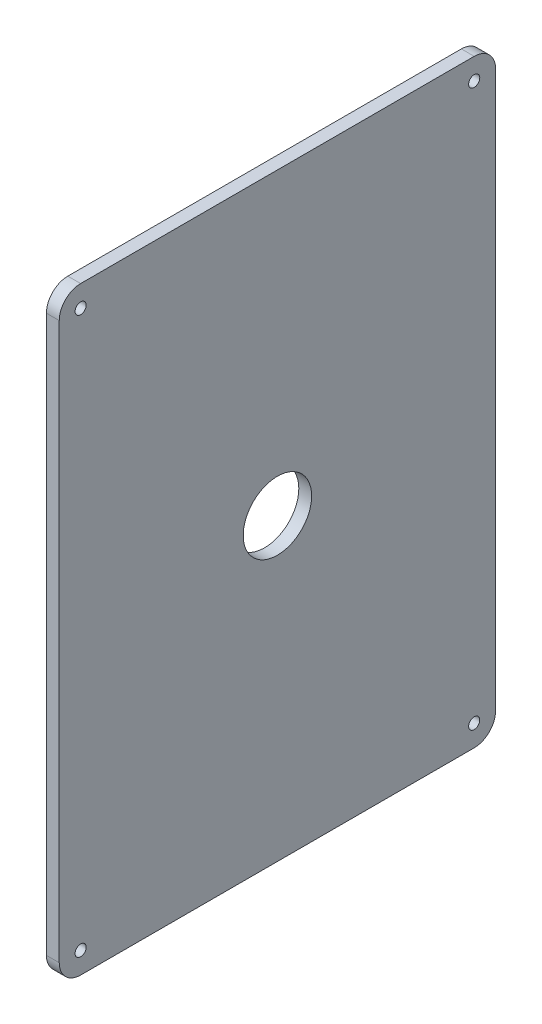
ISO-10303-21;
HEADER;
FILE_DESCRIPTION(('STEP AP214'),'2;1');
FILE_NAME('part.step','',(''),(''),'','','');
FILE_SCHEMA(('AUTOMOTIVE_DESIGN { 1 0 10303 214 1 1 1 1 }'));
ENDSEC;
DATA;
#1=APPLICATION_CONTEXT('core data for automotive mechanical design processes');
#2=APPLICATION_PROTOCOL_DEFINITION('international standard','automotive_design',2000,#1);
#3=PRODUCT_CONTEXT('',#1,'mechanical');
#4=PRODUCT('Part','Part','',(#3));
#5=PRODUCT_RELATED_PRODUCT_CATEGORY('part','',(#4));
#6=PRODUCT_DEFINITION_FORMATION('','',#4);
#7=PRODUCT_DEFINITION_CONTEXT('part definition',#1,'design');
#8=PRODUCT_DEFINITION('design','',#6,#7);
#9=PRODUCT_DEFINITION_SHAPE('','',#8);
#10=(LENGTH_UNIT() NAMED_UNIT(*) SI_UNIT(.MILLI.,.METRE.));
#11=(NAMED_UNIT(*) PLANE_ANGLE_UNIT() SI_UNIT($,.RADIAN.));
#12=(NAMED_UNIT(*) SI_UNIT($,.STERADIAN.) SOLID_ANGLE_UNIT());
#13=UNCERTAINTY_MEASURE_WITH_UNIT(LENGTH_MEASURE(1.E-05),#10,'distance_accuracy_value','');
#14=(GEOMETRIC_REPRESENTATION_CONTEXT(3) GLOBAL_UNCERTAINTY_ASSIGNED_CONTEXT((#13)) GLOBAL_UNIT_ASSIGNED_CONTEXT((#10,
#11,#12)) REPRESENTATION_CONTEXT('',''));
#15=CARTESIAN_POINT('',(0.,0.,0.));
#16=DIRECTION('',(0.,0.,1.));
#17=DIRECTION('',(1.,0.,0.));
#18=AXIS2_PLACEMENT_3D('',#15,#16,#17);
#19=CARTESIAN_POINT('',(3.,0.,0.));
#20=DIRECTION('',(0.,0.,-1.));
#21=DIRECTION('',(0.,1.,0.));
#22=AXIS2_PLACEMENT_3D('',#19,#20,#21);
#23=PLANE('',#22);
#24=DIRECTION('',(0.,-1.,0.));
#25=VECTOR('',#24,1.);
#26=CARTESIAN_POINT('',(3.,0.,0.));
#27=LINE('',#26,#25);
#28=CARTESIAN_POINT('',(3.,-5.,0.));
#29=VERTEX_POINT('',#28);
#30=CARTESIAN_POINT('',(3.,-135.,0.));
#31=VERTEX_POINT('',#30);
#32=EDGE_CURVE('E121',#29,#31,#27,.T.);
#33=ORIENTED_EDGE('',*,*,#32,.F.);
#34=DIRECTION('',(-1.,0.,0.));
#35=VECTOR('',#34,1.);
#36=CARTESIAN_POINT('',(3.,-5.,0.));
#37=LINE('',#36,#35);
#38=CARTESIAN_POINT('',(0.,-5.,0.));
#39=VERTEX_POINT('',#38);
#40=EDGE_CURVE('E106',#29,#39,#37,.T.);
#41=ORIENTED_EDGE('',*,*,#40,.T.);
#42=DIRECTION('',(0.,-1.,0.));
#43=VECTOR('',#42,1.);
#44=CARTESIAN_POINT('',(0.,0.,0.));
#45=LINE('',#44,#43);
#46=CARTESIAN_POINT('',(0.,-135.,0.));
#47=VERTEX_POINT('',#46);
#48=EDGE_CURVE('E118',#39,#47,#45,.T.);
#49=ORIENTED_EDGE('',*,*,#48,.T.);
#50=DIRECTION('',(-1.,0.,0.));
#51=VECTOR('',#50,1.);
#52=CARTESIAN_POINT('',(3.,-135.,0.));
#53=LINE('',#52,#51);
#54=EDGE_CURVE('E123',#47,#31,#53,.F.);
#55=ORIENTED_EDGE('',*,*,#54,.T.);
#56=EDGE_LOOP('',(#33,#41,#49,#55));
#57=FACE_BOUND('',#56,.T.);
#58=ADVANCED_FACE('F34',(#57),#23,.F.);
#59=CARTESIAN_POINT('',(3.,-140.,0.));
#60=DIRECTION('',(0.,1.,0.));
#61=DIRECTION('',(0.,0.,1.));
#62=AXIS2_PLACEMENT_3D('',#59,#60,#61);
#63=PLANE('',#62);
#64=DIRECTION('',(0.,0.,-1.));
#65=VECTOR('',#64,1.);
#66=CARTESIAN_POINT('',(0.,-140.,0.));
#67=LINE('',#66,#65);
#68=CARTESIAN_POINT('',(0.,-140.,-5.00000000000002));
#69=VERTEX_POINT('',#68);
#70=CARTESIAN_POINT('',(0.,-140.,-97.));
#71=VERTEX_POINT('',#70);
#72=EDGE_CURVE('E127',#69,#71,#67,.T.);
#73=ORIENTED_EDGE('',*,*,#72,.T.);
#74=DIRECTION('',(-1.,0.,0.));
#75=VECTOR('',#74,1.);
#76=CARTESIAN_POINT('',(3.,-140.,-97.));
#77=LINE('',#76,#75);
#78=CARTESIAN_POINT('',(3.,-140.,-97.));
#79=VERTEX_POINT('',#78);
#80=EDGE_CURVE('E11',#71,#79,#77,.F.);
#81=ORIENTED_EDGE('',*,*,#80,.T.);
#82=DIRECTION('',(0.,0.,-1.));
#83=VECTOR('',#82,1.);
#84=CARTESIAN_POINT('',(3.,-140.,0.));
#85=LINE('',#84,#83);
#86=CARTESIAN_POINT('',(3.,-140.,-5.00000000000002));
#87=VERTEX_POINT('',#86);
#88=EDGE_CURVE('E184',#87,#79,#85,.T.);
#89=ORIENTED_EDGE('',*,*,#88,.F.);
#90=DIRECTION('',(-1.,0.,0.));
#91=VECTOR('',#90,1.);
#92=CARTESIAN_POINT('',(3.,-140.,-5.00000000000002));
#93=LINE('',#92,#91);
#94=EDGE_CURVE('E43',#87,#69,#93,.T.);
#95=ORIENTED_EDGE('',*,*,#94,.T.);
#96=EDGE_LOOP('',(#73,#81,#89,#95));
#97=FACE_BOUND('',#96,.T.);
#98=ADVANCED_FACE('F202',(#97),#63,.F.);
#99=CARTESIAN_POINT('',(3.,0.,-102.));
#100=DIRECTION('',(0.,0.,1.));
#101=DIRECTION('',(0.,-1.,0.));
#102=AXIS2_PLACEMENT_3D('',#99,#100,#101);
#103=PLANE('',#102);
#104=DIRECTION('',(0.,1.,0.));
#105=VECTOR('',#104,1.);
#106=CARTESIAN_POINT('',(0.,0.,-102.));
#107=LINE('',#106,#105);
#108=CARTESIAN_POINT('',(0.,-135.,-102.));
#109=VERTEX_POINT('',#108);
#110=CARTESIAN_POINT('',(0.,-5.,-102.));
#111=VERTEX_POINT('',#110);
#112=EDGE_CURVE('E131',#109,#111,#107,.T.);
#113=ORIENTED_EDGE('',*,*,#112,.T.);
#114=DIRECTION('',(-1.,0.,0.));
#115=VECTOR('',#114,1.);
#116=CARTESIAN_POINT('',(3.,-5.,-102.));
#117=LINE('',#116,#115);
#118=CARTESIAN_POINT('',(3.,-5.,-102.));
#119=VERTEX_POINT('',#118);
#120=EDGE_CURVE('E51',#111,#119,#117,.F.);
#121=ORIENTED_EDGE('',*,*,#120,.T.);
#122=DIRECTION('',(0.,1.,0.));
#123=VECTOR('',#122,1.);
#124=CARTESIAN_POINT('',(3.,0.,-102.));
#125=LINE('',#124,#123);
#126=CARTESIAN_POINT('',(3.,-135.,-102.));
#127=VERTEX_POINT('',#126);
#128=EDGE_CURVE('E185',#127,#119,#125,.T.);
#129=ORIENTED_EDGE('',*,*,#128,.F.);
#130=DIRECTION('',(-1.,0.,0.));
#131=VECTOR('',#130,1.);
#132=CARTESIAN_POINT('',(3.,-135.,-102.));
#133=LINE('',#132,#131);
#134=EDGE_CURVE('E158',#127,#109,#133,.T.);
#135=ORIENTED_EDGE('',*,*,#134,.T.);
#136=EDGE_LOOP('',(#113,#121,#129,#135));
#137=FACE_BOUND('',#136,.T.);
#138=ADVANCED_FACE('F196',(#137),#103,.F.);
#139=CARTESIAN_POINT('',(3.,0.,0.));
#140=DIRECTION('',(0.,-1.,0.));
#141=DIRECTION('',(0.,0.,-1.));
#142=AXIS2_PLACEMENT_3D('',#139,#140,#141);
#143=PLANE('',#142);
#144=DIRECTION('',(0.,0.,1.));
#145=VECTOR('',#144,1.);
#146=CARTESIAN_POINT('',(0.,0.,0.));
#147=LINE('',#146,#145);
#148=CARTESIAN_POINT('',(0.,0.,-97.));
#149=VERTEX_POINT('',#148);
#150=CARTESIAN_POINT('',(0.,0.,-5.));
#151=VERTEX_POINT('',#150);
#152=EDGE_CURVE('E141',#149,#151,#147,.T.);
#153=ORIENTED_EDGE('',*,*,#152,.T.);
#154=DIRECTION('',(-1.,0.,0.));
#155=VECTOR('',#154,1.);
#156=CARTESIAN_POINT('',(3.,0.,-5.));
#157=LINE('',#156,#155);
#158=CARTESIAN_POINT('',(3.,0.,-5.));
#159=VERTEX_POINT('',#158);
#160=EDGE_CURVE('E107',#151,#159,#157,.F.);
#161=ORIENTED_EDGE('',*,*,#160,.T.);
#162=DIRECTION('',(0.,0.,1.));
#163=VECTOR('',#162,1.);
#164=CARTESIAN_POINT('',(3.,0.,0.));
#165=LINE('',#164,#163);
#166=CARTESIAN_POINT('',(3.,0.,-97.));
#167=VERTEX_POINT('',#166);
#168=EDGE_CURVE('E137',#167,#159,#165,.T.);
#169=ORIENTED_EDGE('',*,*,#168,.F.);
#170=DIRECTION('',(-1.,0.,0.));
#171=VECTOR('',#170,1.);
#172=CARTESIAN_POINT('',(3.,0.,-97.));
#173=LINE('',#172,#171);
#174=EDGE_CURVE('E112',#167,#149,#173,.T.);
#175=ORIENTED_EDGE('',*,*,#174,.T.);
#176=EDGE_LOOP('',(#153,#161,#169,#175));
#177=FACE_BOUND('',#176,.T.);
#178=ADVANCED_FACE('F192',(#177),#143,.F.);
#179=CARTESIAN_POINT('',(3.,0.,0.));
#180=DIRECTION('',(1.,0.,0.));
#181=DIRECTION('',(0.,0.,-1.));
#182=AXIS2_PLACEMENT_3D('',#179,#180,#181);
#183=PLANE('',#182);
#184=CARTESIAN_POINT('',(3.,-135.,-97.));
#185=DIRECTION('',(1.,0.,0.));
#186=DIRECTION('',(0.,0.,-1.));
#187=AXIS2_PLACEMENT_3D('',#184,#185,#186);
#188=CIRCLE('',#187,1.29999999999999);
#189=CARTESIAN_POINT('',(3.,-135.,-98.3));
#190=VERTEX_POINT('',#189);
#191=EDGE_CURVE('E339',#190,#190,#188,.T.);
#192=ORIENTED_EDGE('',*,*,#191,.F.);
#193=EDGE_LOOP('',(#192));
#194=FACE_BOUND('',#193,.T.);
#195=CARTESIAN_POINT('',(3.,-5.,-97.));
#196=DIRECTION('',(1.,0.,0.));
#197=DIRECTION('',(0.,0.,-1.));
#198=AXIS2_PLACEMENT_3D('',#195,#196,#197);
#199=CIRCLE('',#198,1.29999999999999);
#200=CARTESIAN_POINT('',(3.,-5.,-98.3));
#201=VERTEX_POINT('',#200);
#202=EDGE_CURVE('E340',#201,#201,#199,.T.);
#203=ORIENTED_EDGE('',*,*,#202,.F.);
#204=EDGE_LOOP('',(#203));
#205=FACE_BOUND('',#204,.T.);
#206=CARTESIAN_POINT('',(3.,-5.,-5.));
#207=DIRECTION('',(1.,0.,0.));
#208=DIRECTION('',(0.,0.,-1.));
#209=AXIS2_PLACEMENT_3D('',#206,#207,#208);
#210=CIRCLE('',#209,1.3);
#211=CARTESIAN_POINT('',(3.,-5.,-6.3));
#212=VERTEX_POINT('',#211);
#213=EDGE_CURVE('E343',#212,#212,#210,.T.);
#214=ORIENTED_EDGE('',*,*,#213,.F.);
#215=EDGE_LOOP('',(#214));
#216=FACE_BOUND('',#215,.T.);
#217=CARTESIAN_POINT('',(3.,-135.,-5.));
#218=DIRECTION('',(1.,0.,0.));
#219=DIRECTION('',(0.,0.,-1.));
#220=AXIS2_PLACEMENT_3D('',#217,#218,#219);
#221=CIRCLE('',#220,1.29999999999999);
#222=CARTESIAN_POINT('',(3.,-135.,-6.3));
#223=VERTEX_POINT('',#222);
#224=EDGE_CURVE('E168',#223,#223,#221,.T.);
#225=ORIENTED_EDGE('',*,*,#224,.F.);
#226=EDGE_LOOP('',(#225));
#227=FACE_BOUND('',#226,.T.);
#228=CARTESIAN_POINT('',(3.,-70.,-51.));
#229=DIRECTION('',(1.,0.,0.));
#230=DIRECTION('',(0.,0.,-1.));
#231=AXIS2_PLACEMENT_3D('',#228,#229,#230);
#232=CIRCLE('',#231,8.);
#233=CARTESIAN_POINT('',(3.,-70.,-59.));
#234=VERTEX_POINT('',#233);
#235=EDGE_CURVE('E134',#234,#234,#232,.T.);
#236=ORIENTED_EDGE('',*,*,#235,.F.);
#237=EDGE_LOOP('',(#236));
#238=FACE_BOUND('',#237,.T.);
#239=ORIENTED_EDGE('',*,*,#168,.T.);
#240=CARTESIAN_POINT('',(3.,-5.,-5.));
#241=DIRECTION('',(1.,0.,0.));
#242=DIRECTION('',(0.,0.,-1.));
#243=AXIS2_PLACEMENT_3D('',#240,#241,#242);
#244=CIRCLE('',#243,5.);
#245=EDGE_CURVE('E156',#159,#29,#244,.T.);
#246=ORIENTED_EDGE('',*,*,#245,.T.);
#247=ORIENTED_EDGE('',*,*,#32,.T.);
#248=CARTESIAN_POINT('',(3.,-135.,-5.00000000000002));
#249=DIRECTION('',(1.,0.,0.));
#250=DIRECTION('',(0.,0.,-1.));
#251=AXIS2_PLACEMENT_3D('',#248,#249,#250);
#252=CIRCLE('',#251,5.);
#253=EDGE_CURVE('E151',#31,#87,#252,.T.);
#254=ORIENTED_EDGE('',*,*,#253,.T.);
#255=ORIENTED_EDGE('',*,*,#88,.T.);
#256=CARTESIAN_POINT('',(3.,-135.,-97.));
#257=DIRECTION('',(1.,0.,0.));
#258=DIRECTION('',(0.,0.,-1.));
#259=AXIS2_PLACEMENT_3D('',#256,#257,#258);
#260=CIRCLE('',#259,5.);
#261=EDGE_CURVE('E58',#79,#127,#260,.T.);
#262=ORIENTED_EDGE('',*,*,#261,.T.);
#263=ORIENTED_EDGE('',*,*,#128,.T.);
#264=CARTESIAN_POINT('',(3.,-5.,-97.));
#265=DIRECTION('',(1.,0.,0.));
#266=DIRECTION('',(0.,0.,-1.));
#267=AXIS2_PLACEMENT_3D('',#264,#265,#266);
#268=CIRCLE('',#267,5.);
#269=EDGE_CURVE('E154',#119,#167,#268,.T.);
#270=ORIENTED_EDGE('',*,*,#269,.T.);
#271=EDGE_LOOP('',(#239,#246,#247,#254,#255,#262,#263,#270));
#272=FACE_BOUND('',#271,.T.);
#273=ADVANCED_FACE('F189',(#194,#205,#216,#227,#238,#272),#183,.T.);
#274=CARTESIAN_POINT('',(0.,0.,0.));
#275=DIRECTION('',(1.,0.,0.));
#276=DIRECTION('',(0.,0.,-1.));
#277=AXIS2_PLACEMENT_3D('',#274,#275,#276);
#278=PLANE('',#277);
#279=CARTESIAN_POINT('',(0.,-135.,-97.));
#280=DIRECTION('',(1.,0.,0.));
#281=DIRECTION('',(0.,0.,-1.));
#282=AXIS2_PLACEMENT_3D('',#279,#280,#281);
#283=CIRCLE('',#282,1.29999999999999);
#284=CARTESIAN_POINT('',(0.,-135.,-98.3));
#285=VERTEX_POINT('',#284);
#286=EDGE_CURVE('E38',#285,#285,#283,.T.);
#287=ORIENTED_EDGE('',*,*,#286,.T.);
#288=EDGE_LOOP('',(#287));
#289=FACE_BOUND('',#288,.T.);
#290=CARTESIAN_POINT('',(0.,-5.,-97.));
#291=DIRECTION('',(1.,0.,0.));
#292=DIRECTION('',(0.,0.,-1.));
#293=AXIS2_PLACEMENT_3D('',#290,#291,#292);
#294=CIRCLE('',#293,1.29999999999999);
#295=CARTESIAN_POINT('',(0.,-5.,-98.3));
#296=VERTEX_POINT('',#295);
#297=EDGE_CURVE('E170',#296,#296,#294,.T.);
#298=ORIENTED_EDGE('',*,*,#297,.T.);
#299=EDGE_LOOP('',(#298));
#300=FACE_BOUND('',#299,.T.);
#301=CARTESIAN_POINT('',(0.,-5.,-5.));
#302=DIRECTION('',(1.,0.,0.));
#303=DIRECTION('',(0.,0.,-1.));
#304=AXIS2_PLACEMENT_3D('',#301,#302,#303);
#305=CIRCLE('',#304,1.3);
#306=CARTESIAN_POINT('',(0.,-5.,-6.3));
#307=VERTEX_POINT('',#306);
#308=EDGE_CURVE('E167',#307,#307,#305,.T.);
#309=ORIENTED_EDGE('',*,*,#308,.T.);
#310=EDGE_LOOP('',(#309));
#311=FACE_BOUND('',#310,.T.);
#312=CARTESIAN_POINT('',(0.,-135.,-5.));
#313=DIRECTION('',(1.,0.,0.));
#314=DIRECTION('',(0.,0.,-1.));
#315=AXIS2_PLACEMENT_3D('',#312,#313,#314);
#316=CIRCLE('',#315,1.29999999999999);
#317=CARTESIAN_POINT('',(0.,-135.,-6.3));
#318=VERTEX_POINT('',#317);
#319=EDGE_CURVE('E164',#318,#318,#316,.T.);
#320=ORIENTED_EDGE('',*,*,#319,.T.);
#321=EDGE_LOOP('',(#320));
#322=FACE_BOUND('',#321,.T.);
#323=CARTESIAN_POINT('',(0.,-70.,-51.));
#324=DIRECTION('',(1.,0.,0.));
#325=DIRECTION('',(0.,0.,-1.));
#326=AXIS2_PLACEMENT_3D('',#323,#324,#325);
#327=CIRCLE('',#326,8.);
#328=CARTESIAN_POINT('',(0.,-70.,-59.));
#329=VERTEX_POINT('',#328);
#330=EDGE_CURVE('E128',#329,#329,#327,.T.);
#331=ORIENTED_EDGE('',*,*,#330,.T.);
#332=EDGE_LOOP('',(#331));
#333=FACE_BOUND('',#332,.T.);
#334=ORIENTED_EDGE('',*,*,#48,.F.);
#335=CARTESIAN_POINT('',(0.,-5.,-5.));
#336=DIRECTION('',(1.,0.,0.));
#337=DIRECTION('',(0.,0.,-1.));
#338=AXIS2_PLACEMENT_3D('',#335,#336,#337);
#339=CIRCLE('',#338,5.);
#340=EDGE_CURVE('E102',#39,#151,#339,.F.);
#341=ORIENTED_EDGE('',*,*,#340,.T.);
#342=ORIENTED_EDGE('',*,*,#152,.F.);
#343=CARTESIAN_POINT('',(0.,-5.,-97.));
#344=DIRECTION('',(1.,0.,0.));
#345=DIRECTION('',(0.,0.,-1.));
#346=AXIS2_PLACEMENT_3D('',#343,#344,#345);
#347=CIRCLE('',#346,5.);
#348=EDGE_CURVE('E113',#149,#111,#347,.F.);
#349=ORIENTED_EDGE('',*,*,#348,.T.);
#350=ORIENTED_EDGE('',*,*,#112,.F.);
#351=CARTESIAN_POINT('',(0.,-135.,-97.));
#352=DIRECTION('',(1.,0.,0.));
#353=DIRECTION('',(0.,0.,-1.));
#354=AXIS2_PLACEMENT_3D('',#351,#352,#353);
#355=CIRCLE('',#354,5.);
#356=EDGE_CURVE('E145',#109,#71,#355,.F.);
#357=ORIENTED_EDGE('',*,*,#356,.T.);
#358=ORIENTED_EDGE('',*,*,#72,.F.);
#359=CARTESIAN_POINT('',(0.,-135.,-5.00000000000002));
#360=DIRECTION('',(1.,0.,0.));
#361=DIRECTION('',(0.,0.,-1.));
#362=AXIS2_PLACEMENT_3D('',#359,#360,#361);
#363=CIRCLE('',#362,5.);
#364=EDGE_CURVE('E122',#69,#47,#363,.F.);
#365=ORIENTED_EDGE('',*,*,#364,.T.);
#366=EDGE_LOOP('',(#334,#341,#342,#349,#350,#357,#358,#365));
#367=FACE_BOUND('',#366,.T.);
#368=ADVANCED_FACE('F125',(#289,#300,#311,#322,#333,#367),#278,.F.);
#369=CARTESIAN_POINT('',(3.,-5.,-5.));
#370=DIRECTION('',(-1.,0.,0.));
#371=DIRECTION('',(0.,0.,1.));
#372=AXIS2_PLACEMENT_3D('',#369,#370,#371);
#373=CYLINDRICAL_SURFACE('',#372,5.);
#374=ORIENTED_EDGE('',*,*,#245,.F.);
#375=ORIENTED_EDGE('',*,*,#160,.F.);
#376=ORIENTED_EDGE('',*,*,#340,.F.);
#377=ORIENTED_EDGE('',*,*,#40,.F.);
#378=EDGE_LOOP('',(#374,#375,#376,#377));
#379=FACE_BOUND('',#378,.T.);
#380=ADVANCED_FACE('F105',(#379),#373,.T.);
#381=CARTESIAN_POINT('',(3.,-5.,-97.));
#382=DIRECTION('',(-1.,0.,0.));
#383=DIRECTION('',(0.,0.,1.));
#384=AXIS2_PLACEMENT_3D('',#381,#382,#383);
#385=CYLINDRICAL_SURFACE('',#384,5.);
#386=ORIENTED_EDGE('',*,*,#269,.F.);
#387=ORIENTED_EDGE('',*,*,#120,.F.);
#388=ORIENTED_EDGE('',*,*,#348,.F.);
#389=ORIENTED_EDGE('',*,*,#174,.F.);
#390=EDGE_LOOP('',(#386,#387,#388,#389));
#391=FACE_BOUND('',#390,.T.);
#392=ADVANCED_FACE('F194',(#391),#385,.T.);
#393=CARTESIAN_POINT('',(3.,-135.,-97.));
#394=DIRECTION('',(-1.,0.,0.));
#395=DIRECTION('',(0.,0.,1.));
#396=AXIS2_PLACEMENT_3D('',#393,#394,#395);
#397=CYLINDRICAL_SURFACE('',#396,5.);
#398=ORIENTED_EDGE('',*,*,#261,.F.);
#399=ORIENTED_EDGE('',*,*,#80,.F.);
#400=ORIENTED_EDGE('',*,*,#356,.F.);
#401=ORIENTED_EDGE('',*,*,#134,.F.);
#402=EDGE_LOOP('',(#398,#399,#400,#401));
#403=FACE_BOUND('',#402,.T.);
#404=ADVANCED_FACE('F199',(#403),#397,.T.);
#405=CARTESIAN_POINT('',(3.,-135.,-5.00000000000002));
#406=DIRECTION('',(-1.,0.,0.));
#407=DIRECTION('',(0.,0.,1.));
#408=AXIS2_PLACEMENT_3D('',#405,#406,#407);
#409=CYLINDRICAL_SURFACE('',#408,5.);
#410=ORIENTED_EDGE('',*,*,#253,.F.);
#411=ORIENTED_EDGE('',*,*,#54,.F.);
#412=ORIENTED_EDGE('',*,*,#364,.F.);
#413=ORIENTED_EDGE('',*,*,#94,.F.);
#414=EDGE_LOOP('',(#410,#411,#412,#413));
#415=FACE_BOUND('',#414,.T.);
#416=ADVANCED_FACE('F36',(#415),#409,.T.);
#417=CARTESIAN_POINT('',(0.,-70.,-51.));
#418=DIRECTION('',(1.,0.,0.));
#419=DIRECTION('',(0.,0.,-1.));
#420=AXIS2_PLACEMENT_3D('',#417,#418,#419);
#421=CYLINDRICAL_SURFACE('',#420,8.);
#422=ORIENTED_EDGE('',*,*,#330,.F.);
#423=EDGE_LOOP('',(#422));
#424=FACE_BOUND('',#423,.T.);
#425=ORIENTED_EDGE('',*,*,#235,.T.);
#426=EDGE_LOOP('',(#425));
#427=FACE_BOUND('',#426,.T.);
#428=ADVANCED_FACE('F208',(#424,#427),#421,.F.);
#429=CARTESIAN_POINT('',(-97.,-135.,-5.));
#430=DIRECTION('',(1.,0.,0.));
#431=DIRECTION('',(0.,0.,-1.));
#432=AXIS2_PLACEMENT_3D('',#429,#430,#431);
#433=CYLINDRICAL_SURFACE('',#432,1.29999999999999);
#434=ORIENTED_EDGE('',*,*,#224,.T.);
#435=EDGE_LOOP('',(#434));
#436=FACE_BOUND('',#435,.T.);
#437=ORIENTED_EDGE('',*,*,#319,.F.);
#438=EDGE_LOOP('',(#437));
#439=FACE_BOUND('',#438,.T.);
#440=ADVANCED_FACE('F213',(#436,#439),#433,.F.);
#441=CARTESIAN_POINT('',(-97.,-5.,-5.));
#442=DIRECTION('',(1.,0.,0.));
#443=DIRECTION('',(0.,0.,-1.));
#444=AXIS2_PLACEMENT_3D('',#441,#442,#443);
#445=CYLINDRICAL_SURFACE('',#444,1.3);
#446=ORIENTED_EDGE('',*,*,#213,.T.);
#447=EDGE_LOOP('',(#446));
#448=FACE_BOUND('',#447,.T.);
#449=ORIENTED_EDGE('',*,*,#308,.F.);
#450=EDGE_LOOP('',(#449));
#451=FACE_BOUND('',#450,.T.);
#452=ADVANCED_FACE('F274',(#448,#451),#445,.F.);
#453=CARTESIAN_POINT('',(-97.,-5.,-97.));
#454=DIRECTION('',(1.,0.,0.));
#455=DIRECTION('',(0.,0.,-1.));
#456=AXIS2_PLACEMENT_3D('',#453,#454,#455);
#457=CYLINDRICAL_SURFACE('',#456,1.29999999999999);
#458=ORIENTED_EDGE('',*,*,#202,.T.);
#459=EDGE_LOOP('',(#458));
#460=FACE_BOUND('',#459,.T.);
#461=ORIENTED_EDGE('',*,*,#297,.F.);
#462=EDGE_LOOP('',(#461));
#463=FACE_BOUND('',#462,.T.);
#464=ADVANCED_FACE('F284',(#460,#463),#457,.F.);
#465=CARTESIAN_POINT('',(-97.,-135.,-97.));
#466=DIRECTION('',(1.,0.,0.));
#467=DIRECTION('',(0.,0.,-1.));
#468=AXIS2_PLACEMENT_3D('',#465,#466,#467);
#469=CYLINDRICAL_SURFACE('',#468,1.29999999999999);
#470=ORIENTED_EDGE('',*,*,#191,.T.);
#471=EDGE_LOOP('',(#470));
#472=FACE_BOUND('',#471,.T.);
#473=ORIENTED_EDGE('',*,*,#286,.F.);
#474=EDGE_LOOP('',(#473));
#475=FACE_BOUND('',#474,.T.);
#476=ADVANCED_FACE('F294',(#472,#475),#469,.F.);
#477=CLOSED_SHELL('',(#58,#98,#138,#178,#273,#368,#380,#392,#404,#416,#428,#440,#452,#464,#476));
#478=MANIFOLD_SOLID_BREP('B2',#477);
#479=ADVANCED_BREP_SHAPE_REPRESENTATION('',(#18,#478),#14);
#480=SHAPE_DEFINITION_REPRESENTATION(#9,#479);
ENDSEC;
END-ISO-10303-21;
